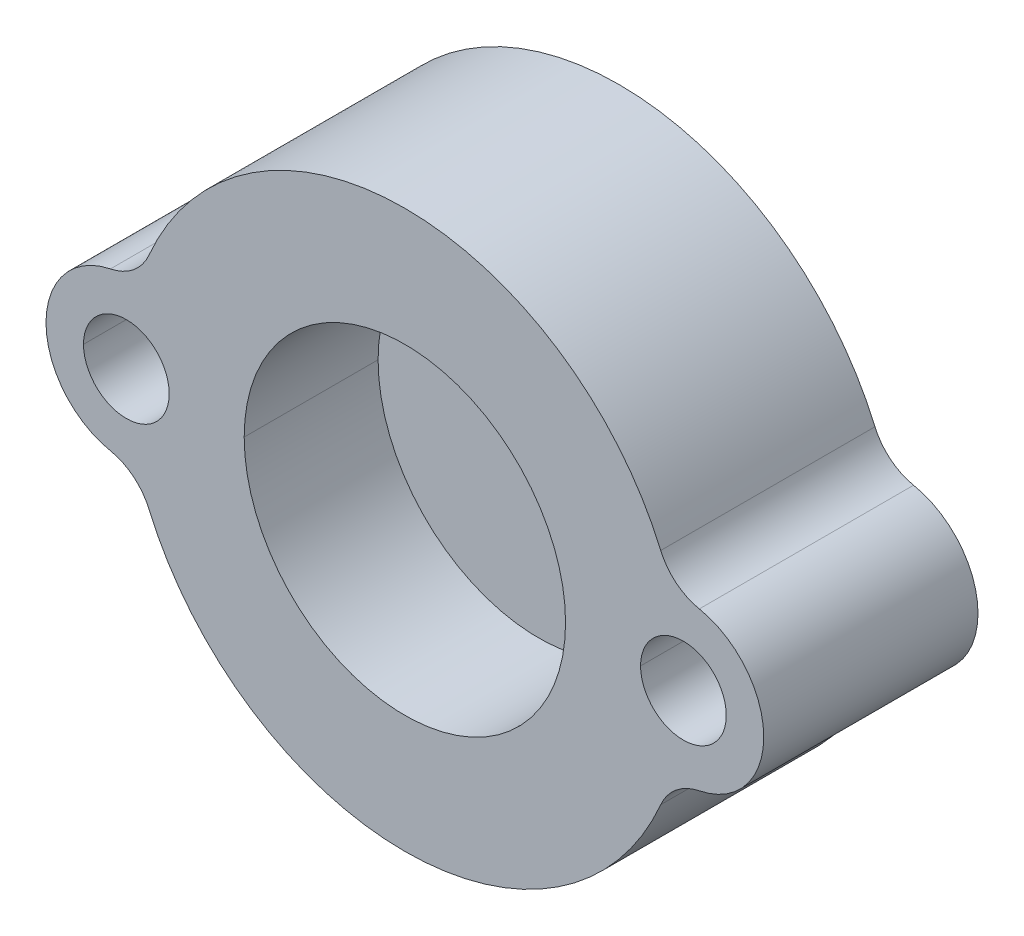
ISO-10303-21;
HEADER;
FILE_DESCRIPTION(('STEP AP214'),'2;1');
FILE_NAME('part.step','',(''),(''),'','','');
FILE_SCHEMA(('AUTOMOTIVE_DESIGN { 1 0 10303 214 1 1 1 1 }'));
ENDSEC;
DATA;
#1=APPLICATION_CONTEXT('core data for automotive mechanical design processes');
#2=APPLICATION_PROTOCOL_DEFINITION('international standard','automotive_design',2000,#1);
#3=PRODUCT_CONTEXT('',#1,'mechanical');
#4=PRODUCT('Part','Part','',(#3));
#5=PRODUCT_RELATED_PRODUCT_CATEGORY('part','',(#4));
#6=PRODUCT_DEFINITION_FORMATION('','',#4);
#7=PRODUCT_DEFINITION_CONTEXT('part definition',#1,'design');
#8=PRODUCT_DEFINITION('design','',#6,#7);
#9=PRODUCT_DEFINITION_SHAPE('','',#8);
#10=(LENGTH_UNIT() NAMED_UNIT(*) SI_UNIT(.MILLI.,.METRE.));
#11=(NAMED_UNIT(*) PLANE_ANGLE_UNIT() SI_UNIT($,.RADIAN.));
#12=(NAMED_UNIT(*) SI_UNIT($,.STERADIAN.) SOLID_ANGLE_UNIT());
#13=UNCERTAINTY_MEASURE_WITH_UNIT(LENGTH_MEASURE(1.E-05),#10,'distance_accuracy_value','');
#14=(GEOMETRIC_REPRESENTATION_CONTEXT(3) GLOBAL_UNCERTAINTY_ASSIGNED_CONTEXT((#13)) GLOBAL_UNIT_ASSIGNED_CONTEXT((#10,
#11,#12)) REPRESENTATION_CONTEXT('',''));
#15=CARTESIAN_POINT('',(0.,0.,0.));
#16=DIRECTION('',(0.,0.,1.));
#17=DIRECTION('',(1.,0.,0.));
#18=AXIS2_PLACEMENT_3D('',#15,#16,#17);
#19=CARTESIAN_POINT('',(-5.2,0.,4.));
#20=DIRECTION('',(0.,0.,1.));
#21=DIRECTION('',(1.,0.,0.));
#22=AXIS2_PLACEMENT_3D('',#19,#20,#21);
#23=CYLINDRICAL_SURFACE('',#22,0.8);
#24=CARTESIAN_POINT('',(-5.2,0.,0.));
#25=DIRECTION('',(0.,0.,1.));
#26=DIRECTION('',(1.,0.,0.));
#27=AXIS2_PLACEMENT_3D('',#24,#25,#26);
#28=CIRCLE('',#27,0.8);
#29=CARTESIAN_POINT('',(-6.,0.,0.));
#30=VERTEX_POINT('',#29);
#31=CARTESIAN_POINT('',(-4.4,0.,0.));
#32=VERTEX_POINT('',#31);
#33=EDGE_CURVE('E41',#30,#32,#28,.T.);
#34=ORIENTED_EDGE('',*,*,#33,.F.);
#35=DIRECTION('',(0.,0.,1.));
#36=VECTOR('',#35,1.);
#37=CARTESIAN_POINT('',(-6.,0.,4.));
#38=LINE('',#37,#36);
#39=CARTESIAN_POINT('',(-6.,0.,4.));
#40=VERTEX_POINT('',#39);
#41=EDGE_CURVE('E11',#30,#40,#38,.T.);
#42=ORIENTED_EDGE('',*,*,#41,.T.);
#43=CARTESIAN_POINT('',(-5.2,0.,4.));
#44=DIRECTION('',(0.,0.,1.));
#45=DIRECTION('',(1.,0.,0.));
#46=AXIS2_PLACEMENT_3D('',#43,#44,#45);
#47=CIRCLE('',#46,0.799999999999988);
#48=CARTESIAN_POINT('',(-4.4,0.,4.));
#49=VERTEX_POINT('',#48);
#50=EDGE_CURVE('E27',#40,#49,#47,.T.);
#51=ORIENTED_EDGE('',*,*,#50,.T.);
#52=DIRECTION('',(0.,0.,1.));
#53=VECTOR('',#52,1.);
#54=CARTESIAN_POINT('',(-4.4,0.,4.));
#55=LINE('',#54,#53);
#56=EDGE_CURVE('E270',#32,#49,#55,.T.);
#57=ORIENTED_EDGE('',*,*,#56,.F.);
#58=EDGE_LOOP('',(#34,#42,#51,#57));
#59=FACE_BOUND('',#58,.T.);
#60=ADVANCED_FACE('F16',(#59),#23,.F.);
#61=CARTESIAN_POINT('',(5.2,0.,4.));
#62=DIRECTION('',(0.,0.,1.));
#63=DIRECTION('',(1.,0.,0.));
#64=AXIS2_PLACEMENT_3D('',#61,#62,#63);
#65=CYLINDRICAL_SURFACE('',#64,0.8);
#66=CARTESIAN_POINT('',(5.2,0.,0.));
#67=DIRECTION('',(0.,0.,1.));
#68=DIRECTION('',(1.,0.,0.));
#69=AXIS2_PLACEMENT_3D('',#66,#67,#68);
#70=CIRCLE('',#69,0.8);
#71=CARTESIAN_POINT('',(4.4,0.,0.));
#72=VERTEX_POINT('',#71);
#73=CARTESIAN_POINT('',(6.,0.,0.));
#74=VERTEX_POINT('',#73);
#75=EDGE_CURVE('E266',#72,#74,#70,.T.);
#76=ORIENTED_EDGE('',*,*,#75,.F.);
#77=DIRECTION('',(0.,0.,1.));
#78=VECTOR('',#77,1.);
#79=CARTESIAN_POINT('',(4.4,0.,4.));
#80=LINE('',#79,#78);
#81=CARTESIAN_POINT('',(4.4,0.,4.));
#82=VERTEX_POINT('',#81);
#83=EDGE_CURVE('E288',#72,#82,#80,.T.);
#84=ORIENTED_EDGE('',*,*,#83,.T.);
#85=CARTESIAN_POINT('',(5.2,0.,4.));
#86=DIRECTION('',(0.,0.,1.));
#87=DIRECTION('',(1.,0.,0.));
#88=AXIS2_PLACEMENT_3D('',#85,#86,#87);
#89=CIRCLE('',#88,0.799999999999988);
#90=CARTESIAN_POINT('',(6.,0.,4.));
#91=VERTEX_POINT('',#90);
#92=EDGE_CURVE('E291',#82,#91,#89,.T.);
#93=ORIENTED_EDGE('',*,*,#92,.T.);
#94=DIRECTION('',(0.,0.,1.));
#95=VECTOR('',#94,1.);
#96=CARTESIAN_POINT('',(6.,0.,4.));
#97=LINE('',#96,#95);
#98=EDGE_CURVE('E257',#74,#91,#97,.T.);
#99=ORIENTED_EDGE('',*,*,#98,.F.);
#100=EDGE_LOOP('',(#76,#84,#93,#99));
#101=FACE_BOUND('',#100,.T.);
#102=ADVANCED_FACE('F515',(#101),#65,.F.);
#103=CARTESIAN_POINT('',(0.,0.,1.5));
#104=DIRECTION('',(0.,0.,1.));
#105=DIRECTION('',(1.,0.,0.));
#106=AXIS2_PLACEMENT_3D('',#103,#104,#105);
#107=CYLINDRICAL_SURFACE('',#106,3.);
#108=CARTESIAN_POINT('',(0.,0.,1.5));
#109=DIRECTION('',(0.,0.,1.));
#110=DIRECTION('',(1.,0.,0.));
#111=AXIS2_PLACEMENT_3D('',#108,#109,#110);
#112=CIRCLE('',#111,3.);
#113=CARTESIAN_POINT('',(-3.,0.,1.5));
#114=VERTEX_POINT('',#113);
#115=CARTESIAN_POINT('',(3.,0.,1.5));
#116=VERTEX_POINT('',#115);
#117=EDGE_CURVE('E120',#114,#116,#112,.T.);
#118=ORIENTED_EDGE('',*,*,#117,.F.);
#119=DIRECTION('',(0.,0.,1.));
#120=VECTOR('',#119,1.);
#121=CARTESIAN_POINT('',(-3.,0.,1.5));
#122=LINE('',#121,#120);
#123=CARTESIAN_POINT('',(-3.,0.,4.));
#124=VERTEX_POINT('',#123);
#125=EDGE_CURVE('E206',#114,#124,#122,.T.);
#126=ORIENTED_EDGE('',*,*,#125,.T.);
#127=CARTESIAN_POINT('',(0.,0.,4.));
#128=DIRECTION('',(0.,0.,1.));
#129=DIRECTION('',(1.,0.,0.));
#130=AXIS2_PLACEMENT_3D('',#127,#128,#129);
#131=CIRCLE('',#130,3.);
#132=CARTESIAN_POINT('',(3.,0.,4.));
#133=VERTEX_POINT('',#132);
#134=EDGE_CURVE('E132',#124,#133,#131,.T.);
#135=ORIENTED_EDGE('',*,*,#134,.T.);
#136=DIRECTION('',(0.,0.,1.));
#137=VECTOR('',#136,1.);
#138=CARTESIAN_POINT('',(3.,0.,1.5));
#139=LINE('',#138,#137);
#140=EDGE_CURVE('E252',#116,#133,#139,.T.);
#141=ORIENTED_EDGE('',*,*,#140,.F.);
#142=EDGE_LOOP('',(#118,#126,#135,#141));
#143=FACE_BOUND('',#142,.T.);
#144=ADVANCED_FACE('F519',(#143),#107,.F.);
#145=CARTESIAN_POINT('',(-5.2,0.,4.));
#146=DIRECTION('',(0.,0.,-1.));
#147=DIRECTION('',(-1.,0.,0.));
#148=AXIS2_PLACEMENT_3D('',#145,#146,#147);
#149=CYLINDRICAL_SURFACE('',#148,1.5);
#150=CARTESIAN_POINT('',(-5.2,0.,4.));
#151=DIRECTION('',(0.,0.,1.));
#152=DIRECTION('',(1.,0.,0.));
#153=AXIS2_PLACEMENT_3D('',#150,#151,#152);
#154=CIRCLE('',#153,1.5);
#155=CARTESIAN_POINT('',(-6.7,0.,4.));
#156=VERTEX_POINT('',#155);
#157=CARTESIAN_POINT('',(-5.49711538461538,-1.47027971768125,4.));
#158=VERTEX_POINT('',#157);
#159=EDGE_CURVE('E193',#156,#158,#154,.T.);
#160=ORIENTED_EDGE('',*,*,#159,.F.);
#161=DIRECTION('',(0.,0.,-1.));
#162=VECTOR('',#161,1.);
#163=CARTESIAN_POINT('',(-6.7,0.,4.));
#164=LINE('',#163,#162);
#165=CARTESIAN_POINT('',(-6.7,0.,0.));
#166=VERTEX_POINT('',#165);
#167=EDGE_CURVE('E212',#156,#166,#164,.T.);
#168=ORIENTED_EDGE('',*,*,#167,.T.);
#169=CARTESIAN_POINT('',(-5.2,0.,0.));
#170=DIRECTION('',(0.,0.,1.));
#171=DIRECTION('',(1.,0.,0.));
#172=AXIS2_PLACEMENT_3D('',#169,#170,#171);
#173=CIRCLE('',#172,1.5);
#174=CARTESIAN_POINT('',(-5.49711538461538,-1.47027971768125,0.));
#175=VERTEX_POINT('',#174);
#176=EDGE_CURVE('E216',#166,#175,#173,.T.);
#177=ORIENTED_EDGE('',*,*,#176,.T.);
#178=DIRECTION('',(0.,0.,1.));
#179=VECTOR('',#178,1.);
#180=CARTESIAN_POINT('',(-5.49711538461538,-1.47027971768125,4.));
#181=LINE('',#180,#179);
#182=EDGE_CURVE('E240',#175,#158,#181,.T.);
#183=ORIENTED_EDGE('',*,*,#182,.T.);
#184=EDGE_LOOP('',(#160,#168,#177,#183));
#185=FACE_BOUND('',#184,.T.);
#186=ADVANCED_FACE('F502',(#185),#149,.T.);
#187=CARTESIAN_POINT('',(0.,0.,4.));
#188=DIRECTION('',(0.,0.,-1.));
#189=DIRECTION('',(-1.,0.,0.));
#190=AXIS2_PLACEMENT_3D('',#187,#188,#189);
#191=CYLINDRICAL_SURFACE('',#190,5.2);
#192=CARTESIAN_POINT('',(0.,0.,0.));
#193=DIRECTION('',(0.,0.,1.));
#194=DIRECTION('',(1.,0.,0.));
#195=AXIS2_PLACEMENT_3D('',#192,#193,#194);
#196=CIRCLE('',#195,5.2);
#197=CARTESIAN_POINT('',(4.77661290322581,2.05522971288777,0.));
#198=VERTEX_POINT('',#197);
#199=CARTESIAN_POINT('',(-4.77661290322581,2.05522971288777,0.));
#200=VERTEX_POINT('',#199);
#201=EDGE_CURVE('E242',#198,#200,#196,.T.);
#202=ORIENTED_EDGE('',*,*,#201,.T.);
#203=DIRECTION('',(0.,0.,1.));
#204=VECTOR('',#203,1.);
#205=CARTESIAN_POINT('',(-4.77661290322581,2.05522971288777,4.));
#206=LINE('',#205,#204);
#207=CARTESIAN_POINT('',(-4.77661290322581,2.05522971288777,4.));
#208=VERTEX_POINT('',#207);
#209=EDGE_CURVE('E292',#200,#208,#206,.T.);
#210=ORIENTED_EDGE('',*,*,#209,.T.);
#211=CARTESIAN_POINT('',(0.,0.,4.));
#212=DIRECTION('',(0.,0.,1.));
#213=DIRECTION('',(1.,0.,0.));
#214=AXIS2_PLACEMENT_3D('',#211,#212,#213);
#215=CIRCLE('',#214,5.2);
#216=CARTESIAN_POINT('',(4.77661290322581,2.05522971288777,4.));
#217=VERTEX_POINT('',#216);
#218=EDGE_CURVE('E223',#217,#208,#215,.T.);
#219=ORIENTED_EDGE('',*,*,#218,.F.);
#220=DIRECTION('',(0.,0.,-1.));
#221=VECTOR('',#220,1.);
#222=CARTESIAN_POINT('',(4.77661290322581,2.05522971288777,4.));
#223=LINE('',#222,#221);
#224=EDGE_CURVE('E296',#217,#198,#223,.T.);
#225=ORIENTED_EDGE('',*,*,#224,.T.);
#226=EDGE_LOOP('',(#202,#210,#219,#225));
#227=FACE_BOUND('',#226,.T.);
#228=ADVANCED_FACE('F497',(#227),#191,.T.);
#229=CARTESIAN_POINT('',(-5.2,0.,4.));
#230=DIRECTION('',(0.,0.,-1.));
#231=DIRECTION('',(-1.,0.,0.));
#232=AXIS2_PLACEMENT_3D('',#229,#230,#231);
#233=CYLINDRICAL_SURFACE('',#232,1.5);
#234=ORIENTED_EDGE('',*,*,#167,.F.);
#235=CARTESIAN_POINT('',(-5.2,0.,4.));
#236=DIRECTION('',(0.,0.,1.));
#237=DIRECTION('',(1.,0.,0.));
#238=AXIS2_PLACEMENT_3D('',#235,#236,#237);
#239=CIRCLE('',#238,1.5);
#240=CARTESIAN_POINT('',(-5.49711538461538,1.47027971768125,4.));
#241=VERTEX_POINT('',#240);
#242=EDGE_CURVE('E202',#241,#156,#239,.T.);
#243=ORIENTED_EDGE('',*,*,#242,.F.);
#244=DIRECTION('',(0.,0.,-1.));
#245=VECTOR('',#244,1.);
#246=CARTESIAN_POINT('',(-5.49711538461538,1.47027971768125,4.));
#247=LINE('',#246,#245);
#248=CARTESIAN_POINT('',(-5.49711538461538,1.47027971768125,0.));
#249=VERTEX_POINT('',#248);
#250=EDGE_CURVE('E306',#241,#249,#247,.T.);
#251=ORIENTED_EDGE('',*,*,#250,.T.);
#252=CARTESIAN_POINT('',(-5.2,0.,0.));
#253=DIRECTION('',(0.,0.,1.));
#254=DIRECTION('',(1.,0.,0.));
#255=AXIS2_PLACEMENT_3D('',#252,#253,#254);
#256=CIRCLE('',#255,1.5);
#257=EDGE_CURVE('E20',#249,#166,#256,.T.);
#258=ORIENTED_EDGE('',*,*,#257,.T.);
#259=EDGE_LOOP('',(#234,#243,#251,#258));
#260=FACE_BOUND('',#259,.T.);
#261=ADVANCED_FACE('F501',(#260),#233,.T.);
#262=CARTESIAN_POINT('',(0.,0.,4.));
#263=DIRECTION('',(0.,0.,-1.));
#264=DIRECTION('',(-1.,0.,0.));
#265=AXIS2_PLACEMENT_3D('',#262,#263,#264);
#266=CYLINDRICAL_SURFACE('',#265,5.2);
#267=CARTESIAN_POINT('',(0.,0.,4.));
#268=DIRECTION('',(0.,0.,1.));
#269=DIRECTION('',(1.,0.,0.));
#270=AXIS2_PLACEMENT_3D('',#267,#268,#269);
#271=CIRCLE('',#270,5.2);
#272=CARTESIAN_POINT('',(-4.77661290322581,-2.05522971288777,4.));
#273=VERTEX_POINT('',#272);
#274=CARTESIAN_POINT('',(4.77661290322581,-2.05522971288777,4.));
#275=VERTEX_POINT('',#274);
#276=EDGE_CURVE('E167',#273,#275,#271,.T.);
#277=ORIENTED_EDGE('',*,*,#276,.F.);
#278=DIRECTION('',(0.,0.,-1.));
#279=VECTOR('',#278,1.);
#280=CARTESIAN_POINT('',(-4.77661290322581,-2.05522971288777,4.));
#281=LINE('',#280,#279);
#282=CARTESIAN_POINT('',(-4.77661290322581,-2.05522971288777,0.));
#283=VERTEX_POINT('',#282);
#284=EDGE_CURVE('E171',#273,#283,#281,.T.);
#285=ORIENTED_EDGE('',*,*,#284,.T.);
#286=CARTESIAN_POINT('',(0.,0.,0.));
#287=DIRECTION('',(0.,0.,1.));
#288=DIRECTION('',(1.,0.,0.));
#289=AXIS2_PLACEMENT_3D('',#286,#287,#288);
#290=CIRCLE('',#289,5.2);
#291=CARTESIAN_POINT('',(4.77661290322581,-2.05522971288777,0.));
#292=VERTEX_POINT('',#291);
#293=EDGE_CURVE('E188',#283,#292,#290,.T.);
#294=ORIENTED_EDGE('',*,*,#293,.T.);
#295=DIRECTION('',(0.,0.,1.));
#296=VECTOR('',#295,1.);
#297=CARTESIAN_POINT('',(4.77661290322581,-2.05522971288777,4.));
#298=LINE('',#297,#296);
#299=EDGE_CURVE('E173',#292,#275,#298,.T.);
#300=ORIENTED_EDGE('',*,*,#299,.T.);
#301=EDGE_LOOP('',(#277,#285,#294,#300));
#302=FACE_BOUND('',#301,.T.);
#303=ADVANCED_FACE('F169',(#302),#266,.T.);
#304=CARTESIAN_POINT('',(5.2,0.,4.));
#305=DIRECTION('',(0.,0.,-1.));
#306=DIRECTION('',(-1.,0.,0.));
#307=AXIS2_PLACEMENT_3D('',#304,#305,#306);
#308=CYLINDRICAL_SURFACE('',#307,1.5);
#309=CARTESIAN_POINT('',(5.2,0.,0.));
#310=DIRECTION('',(0.,0.,1.));
#311=DIRECTION('',(1.,0.,0.));
#312=AXIS2_PLACEMENT_3D('',#309,#310,#311);
#313=CIRCLE('',#312,1.5);
#314=CARTESIAN_POINT('',(5.49711538461538,-1.47027971768125,0.));
#315=VERTEX_POINT('',#314);
#316=CARTESIAN_POINT('',(5.49711538461538,1.47027971768125,0.));
#317=VERTEX_POINT('',#316);
#318=EDGE_CURVE('E320',#315,#317,#313,.T.);
#319=ORIENTED_EDGE('',*,*,#318,.T.);
#320=DIRECTION('',(0.,0.,1.));
#321=VECTOR('',#320,1.);
#322=CARTESIAN_POINT('',(5.49711538461538,1.47027971768125,4.));
#323=LINE('',#322,#321);
#324=CARTESIAN_POINT('',(5.49711538461538,1.47027971768125,4.));
#325=VERTEX_POINT('',#324);
#326=EDGE_CURVE('E210',#317,#325,#323,.T.);
#327=ORIENTED_EDGE('',*,*,#326,.T.);
#328=CARTESIAN_POINT('',(5.2,0.,4.));
#329=DIRECTION('',(0.,0.,1.));
#330=DIRECTION('',(1.,0.,0.));
#331=AXIS2_PLACEMENT_3D('',#328,#329,#330);
#332=CIRCLE('',#331,1.5);
#333=CARTESIAN_POINT('',(5.49711538461538,-1.47027971768125,4.));
#334=VERTEX_POINT('',#333);
#335=EDGE_CURVE('E211',#334,#325,#332,.T.);
#336=ORIENTED_EDGE('',*,*,#335,.F.);
#337=DIRECTION('',(0.,0.,-1.));
#338=VECTOR('',#337,1.);
#339=CARTESIAN_POINT('',(5.49711538461538,-1.47027971768125,4.));
#340=LINE('',#339,#338);
#341=EDGE_CURVE('E208',#334,#315,#340,.T.);
#342=ORIENTED_EDGE('',*,*,#341,.T.);
#343=EDGE_LOOP('',(#319,#327,#336,#342));
#344=FACE_BOUND('',#343,.T.);
#345=ADVANCED_FACE('F343',(#344),#308,.T.);
#346=CARTESIAN_POINT('',(-2.6,0.,4.));
#347=DIRECTION('',(0.,0.,1.));
#348=DIRECTION('',(1.,0.,0.));
#349=AXIS2_PLACEMENT_3D('',#346,#347,#348);
#350=PLANE('',#349);
#351=ORIENTED_EDGE('',*,*,#335,.T.);
#352=CARTESIAN_POINT('',(5.69519230769231,2.45046619613542,4.));
#353=DIRECTION('',(0.,0.,-1.));
#354=DIRECTION('',(1.,0.,0.));
#355=AXIS2_PLACEMENT_3D('',#352,#353,#354);
#356=CIRCLE('',#355,1.);
#357=EDGE_CURVE('E219',#325,#217,#356,.T.);
#358=ORIENTED_EDGE('',*,*,#357,.T.);
#359=ORIENTED_EDGE('',*,*,#218,.T.);
#360=CARTESIAN_POINT('',(-5.69519230769231,2.45046619613542,4.));
#361=DIRECTION('',(0.,0.,-1.));
#362=DIRECTION('',(1.,0.,0.));
#363=AXIS2_PLACEMENT_3D('',#360,#361,#362);
#364=CIRCLE('',#363,1.);
#365=EDGE_CURVE('E224',#208,#241,#364,.T.);
#366=ORIENTED_EDGE('',*,*,#365,.T.);
#367=ORIENTED_EDGE('',*,*,#242,.T.);
#368=ORIENTED_EDGE('',*,*,#159,.T.);
#369=CARTESIAN_POINT('',(-5.69519230769231,-2.45046619613542,4.));
#370=DIRECTION('',(0.,0.,-1.));
#371=DIRECTION('',(1.,0.,0.));
#372=AXIS2_PLACEMENT_3D('',#369,#370,#371);
#373=CIRCLE('',#372,1.);
#374=EDGE_CURVE('E179',#158,#273,#373,.T.);
#375=ORIENTED_EDGE('',*,*,#374,.T.);
#376=ORIENTED_EDGE('',*,*,#276,.T.);
#377=CARTESIAN_POINT('',(5.69519230769231,-2.45046619613542,4.));
#378=DIRECTION('',(0.,0.,-1.));
#379=DIRECTION('',(1.,0.,0.));
#380=AXIS2_PLACEMENT_3D('',#377,#378,#379);
#381=CIRCLE('',#380,1.);
#382=EDGE_CURVE('E180',#275,#334,#381,.T.);
#383=ORIENTED_EDGE('',*,*,#382,.T.);
#384=EDGE_LOOP('',(#351,#358,#359,#366,#367,#368,#375,#376,#383));
#385=FACE_BOUND('',#384,.T.);
#386=CARTESIAN_POINT('',(-5.2,0.,4.));
#387=DIRECTION('',(0.,0.,1.));
#388=DIRECTION('',(1.,0.,0.));
#389=AXIS2_PLACEMENT_3D('',#386,#387,#388);
#390=CIRCLE('',#389,0.799999999999988);
#391=EDGE_CURVE('E267',#49,#40,#390,.T.);
#392=ORIENTED_EDGE('',*,*,#391,.F.);
#393=ORIENTED_EDGE('',*,*,#50,.F.);
#394=EDGE_LOOP('',(#392,#393));
#395=FACE_BOUND('',#394,.T.);
#396=CARTESIAN_POINT('',(5.2,0.,4.));
#397=DIRECTION('',(0.,0.,1.));
#398=DIRECTION('',(1.,0.,0.));
#399=AXIS2_PLACEMENT_3D('',#396,#397,#398);
#400=CIRCLE('',#399,0.799999999999988);
#401=EDGE_CURVE('E260',#91,#82,#400,.T.);
#402=ORIENTED_EDGE('',*,*,#401,.F.);
#403=ORIENTED_EDGE('',*,*,#92,.F.);
#404=EDGE_LOOP('',(#402,#403));
#405=FACE_BOUND('',#404,.T.);
#406=CARTESIAN_POINT('',(0.,0.,4.));
#407=DIRECTION('',(0.,0.,1.));
#408=DIRECTION('',(1.,0.,0.));
#409=AXIS2_PLACEMENT_3D('',#406,#407,#408);
#410=CIRCLE('',#409,3.);
#411=EDGE_CURVE('E248',#133,#124,#410,.T.);
#412=ORIENTED_EDGE('',*,*,#411,.F.);
#413=ORIENTED_EDGE('',*,*,#134,.F.);
#414=EDGE_LOOP('',(#412,#413));
#415=FACE_BOUND('',#414,.T.);
#416=ADVANCED_FACE('F190',(#385,#395,#405,#415),#350,.T.);
#417=CARTESIAN_POINT('',(-2.6,0.,0.));
#418=DIRECTION('',(0.,0.,1.));
#419=DIRECTION('',(1.,0.,0.));
#420=AXIS2_PLACEMENT_3D('',#417,#418,#419);
#421=PLANE('',#420);
#422=ORIENTED_EDGE('',*,*,#201,.F.);
#423=CARTESIAN_POINT('',(5.69519230769231,2.45046619613542,0.));
#424=DIRECTION('',(0.,0.,1.));
#425=DIRECTION('',(1.,0.,0.));
#426=AXIS2_PLACEMENT_3D('',#423,#424,#425);
#427=CIRCLE('',#426,1.);
#428=EDGE_CURVE('E253',#198,#317,#427,.T.);
#429=ORIENTED_EDGE('',*,*,#428,.T.);
#430=ORIENTED_EDGE('',*,*,#318,.F.);
#431=CARTESIAN_POINT('',(5.69519230769231,-2.45046619613542,0.));
#432=DIRECTION('',(0.,0.,1.));
#433=DIRECTION('',(1.,0.,0.));
#434=AXIS2_PLACEMENT_3D('',#431,#432,#433);
#435=CIRCLE('',#434,1.);
#436=EDGE_CURVE('E237',#315,#292,#435,.T.);
#437=ORIENTED_EDGE('',*,*,#436,.T.);
#438=ORIENTED_EDGE('',*,*,#293,.F.);
#439=CARTESIAN_POINT('',(-5.69519230769231,-2.45046619613542,0.));
#440=DIRECTION('',(0.,0.,1.));
#441=DIRECTION('',(1.,0.,0.));
#442=AXIS2_PLACEMENT_3D('',#439,#440,#441);
#443=CIRCLE('',#442,1.);
#444=EDGE_CURVE('E186',#283,#175,#443,.T.);
#445=ORIENTED_EDGE('',*,*,#444,.T.);
#446=ORIENTED_EDGE('',*,*,#176,.F.);
#447=ORIENTED_EDGE('',*,*,#257,.F.);
#448=CARTESIAN_POINT('',(-5.69519230769231,2.45046619613542,0.));
#449=DIRECTION('',(0.,0.,1.));
#450=DIRECTION('',(1.,0.,0.));
#451=AXIS2_PLACEMENT_3D('',#448,#449,#450);
#452=CIRCLE('',#451,1.);
#453=EDGE_CURVE('E234',#249,#200,#452,.T.);
#454=ORIENTED_EDGE('',*,*,#453,.T.);
#455=EDGE_LOOP('',(#422,#429,#430,#437,#438,#445,#446,#447,#454));
#456=FACE_BOUND('',#455,.T.);
#457=CARTESIAN_POINT('',(-5.2,0.,0.));
#458=DIRECTION('',(0.,0.,1.));
#459=DIRECTION('',(1.,0.,0.));
#460=AXIS2_PLACEMENT_3D('',#457,#458,#459);
#461=CIRCLE('',#460,0.8);
#462=EDGE_CURVE('E230',#32,#30,#461,.T.);
#463=ORIENTED_EDGE('',*,*,#462,.T.);
#464=ORIENTED_EDGE('',*,*,#33,.T.);
#465=EDGE_LOOP('',(#463,#464));
#466=FACE_BOUND('',#465,.T.);
#467=CARTESIAN_POINT('',(5.2,0.,0.));
#468=DIRECTION('',(0.,0.,1.));
#469=DIRECTION('',(1.,0.,0.));
#470=AXIS2_PLACEMENT_3D('',#467,#468,#469);
#471=CIRCLE('',#470,0.8);
#472=EDGE_CURVE('E263',#74,#72,#471,.T.);
#473=ORIENTED_EDGE('',*,*,#472,.T.);
#474=ORIENTED_EDGE('',*,*,#75,.T.);
#475=EDGE_LOOP('',(#473,#474));
#476=FACE_BOUND('',#475,.T.);
#477=ADVANCED_FACE('F510',(#456,#466,#476),#421,.F.);
#478=CARTESIAN_POINT('',(0.,0.,1.5));
#479=DIRECTION('',(0.,0.,1.));
#480=DIRECTION('',(1.,0.,0.));
#481=AXIS2_PLACEMENT_3D('',#478,#479,#480);
#482=CYLINDRICAL_SURFACE('',#481,3.);
#483=ORIENTED_EDGE('',*,*,#125,.F.);
#484=CARTESIAN_POINT('',(0.,0.,1.5));
#485=DIRECTION('',(0.,0.,1.));
#486=DIRECTION('',(1.,0.,0.));
#487=AXIS2_PLACEMENT_3D('',#484,#485,#486);
#488=CIRCLE('',#487,3.);
#489=EDGE_CURVE('E244',#116,#114,#488,.T.);
#490=ORIENTED_EDGE('',*,*,#489,.F.);
#491=ORIENTED_EDGE('',*,*,#140,.T.);
#492=ORIENTED_EDGE('',*,*,#411,.T.);
#493=EDGE_LOOP('',(#483,#490,#491,#492));
#494=FACE_BOUND('',#493,.T.);
#495=ADVANCED_FACE('F18',(#494),#482,.F.);
#496=CARTESIAN_POINT('',(0.,0.,1.5));
#497=DIRECTION('',(0.,0.,1.));
#498=DIRECTION('',(1.,0.,0.));
#499=AXIS2_PLACEMENT_3D('',#496,#497,#498);
#500=PLANE('',#499);
#501=ORIENTED_EDGE('',*,*,#489,.T.);
#502=ORIENTED_EDGE('',*,*,#117,.T.);
#503=EDGE_LOOP('',(#501,#502));
#504=FACE_BOUND('',#503,.T.);
#505=ADVANCED_FACE('F542',(#504),#500,.T.);
#506=CARTESIAN_POINT('',(5.2,0.,4.));
#507=DIRECTION('',(0.,0.,1.));
#508=DIRECTION('',(1.,0.,0.));
#509=AXIS2_PLACEMENT_3D('',#506,#507,#508);
#510=CYLINDRICAL_SURFACE('',#509,0.8);
#511=ORIENTED_EDGE('',*,*,#83,.F.);
#512=ORIENTED_EDGE('',*,*,#472,.F.);
#513=ORIENTED_EDGE('',*,*,#98,.T.);
#514=ORIENTED_EDGE('',*,*,#401,.T.);
#515=EDGE_LOOP('',(#511,#512,#513,#514));
#516=FACE_BOUND('',#515,.T.);
#517=ADVANCED_FACE('F492',(#516),#510,.F.);
#518=CARTESIAN_POINT('',(-5.2,0.,4.));
#519=DIRECTION('',(0.,0.,1.));
#520=DIRECTION('',(1.,0.,0.));
#521=AXIS2_PLACEMENT_3D('',#518,#519,#520);
#522=CYLINDRICAL_SURFACE('',#521,0.8);
#523=ORIENTED_EDGE('',*,*,#41,.F.);
#524=ORIENTED_EDGE('',*,*,#462,.F.);
#525=ORIENTED_EDGE('',*,*,#56,.T.);
#526=ORIENTED_EDGE('',*,*,#391,.T.);
#527=EDGE_LOOP('',(#523,#524,#525,#526));
#528=FACE_BOUND('',#527,.T.);
#529=ADVANCED_FACE('F488',(#528),#522,.F.);
#530=CARTESIAN_POINT('',(-5.69519230769231,-2.45046619613542,4.));
#531=DIRECTION('',(0.,0.,1.));
#532=DIRECTION('',(1.,0.,0.));
#533=AXIS2_PLACEMENT_3D('',#530,#531,#532);
#534=CYLINDRICAL_SURFACE('',#533,1.);
#535=ORIENTED_EDGE('',*,*,#374,.F.);
#536=ORIENTED_EDGE('',*,*,#182,.F.);
#537=ORIENTED_EDGE('',*,*,#444,.F.);
#538=ORIENTED_EDGE('',*,*,#284,.F.);
#539=EDGE_LOOP('',(#535,#536,#537,#538));
#540=FACE_BOUND('',#539,.T.);
#541=ADVANCED_FACE('F184',(#540),#534,.F.);
#542=CARTESIAN_POINT('',(-5.69519230769231,2.45046619613542,4.));
#543=DIRECTION('',(0.,0.,1.));
#544=DIRECTION('',(1.,0.,0.));
#545=AXIS2_PLACEMENT_3D('',#542,#543,#544);
#546=CYLINDRICAL_SURFACE('',#545,1.);
#547=ORIENTED_EDGE('',*,*,#365,.F.);
#548=ORIENTED_EDGE('',*,*,#209,.F.);
#549=ORIENTED_EDGE('',*,*,#453,.F.);
#550=ORIENTED_EDGE('',*,*,#250,.F.);
#551=EDGE_LOOP('',(#547,#548,#549,#550));
#552=FACE_BOUND('',#551,.T.);
#553=ADVANCED_FACE('F560',(#552),#546,.F.);
#554=CARTESIAN_POINT('',(5.69519230769231,2.45046619613542,4.));
#555=DIRECTION('',(0.,0.,1.));
#556=DIRECTION('',(1.,0.,0.));
#557=AXIS2_PLACEMENT_3D('',#554,#555,#556);
#558=CYLINDRICAL_SURFACE('',#557,1.);
#559=ORIENTED_EDGE('',*,*,#357,.F.);
#560=ORIENTED_EDGE('',*,*,#326,.F.);
#561=ORIENTED_EDGE('',*,*,#428,.F.);
#562=ORIENTED_EDGE('',*,*,#224,.F.);
#563=EDGE_LOOP('',(#559,#560,#561,#562));
#564=FACE_BOUND('',#563,.T.);
#565=ADVANCED_FACE('F348',(#564),#558,.F.);
#566=CARTESIAN_POINT('',(5.69519230769231,-2.45046619613542,4.));
#567=DIRECTION('',(0.,0.,1.));
#568=DIRECTION('',(1.,0.,0.));
#569=AXIS2_PLACEMENT_3D('',#566,#567,#568);
#570=CYLINDRICAL_SURFACE('',#569,1.);
#571=ORIENTED_EDGE('',*,*,#382,.F.);
#572=ORIENTED_EDGE('',*,*,#299,.F.);
#573=ORIENTED_EDGE('',*,*,#436,.F.);
#574=ORIENTED_EDGE('',*,*,#341,.F.);
#575=EDGE_LOOP('',(#571,#572,#573,#574));
#576=FACE_BOUND('',#575,.T.);
#577=ADVANCED_FACE('F548',(#576),#570,.F.);
#578=CLOSED_SHELL('',(#60,#102,#144,#186,#228,#261,#303,#345,#416,#477,#495,#505,#517,#529,#541,
#553,#565,#577));
#579=MANIFOLD_SOLID_BREP('B1',#578);
#580=ADVANCED_BREP_SHAPE_REPRESENTATION('',(#18,#579),#14);
#581=SHAPE_DEFINITION_REPRESENTATION(#9,#580);
ENDSEC;
END-ISO-10303-21;
